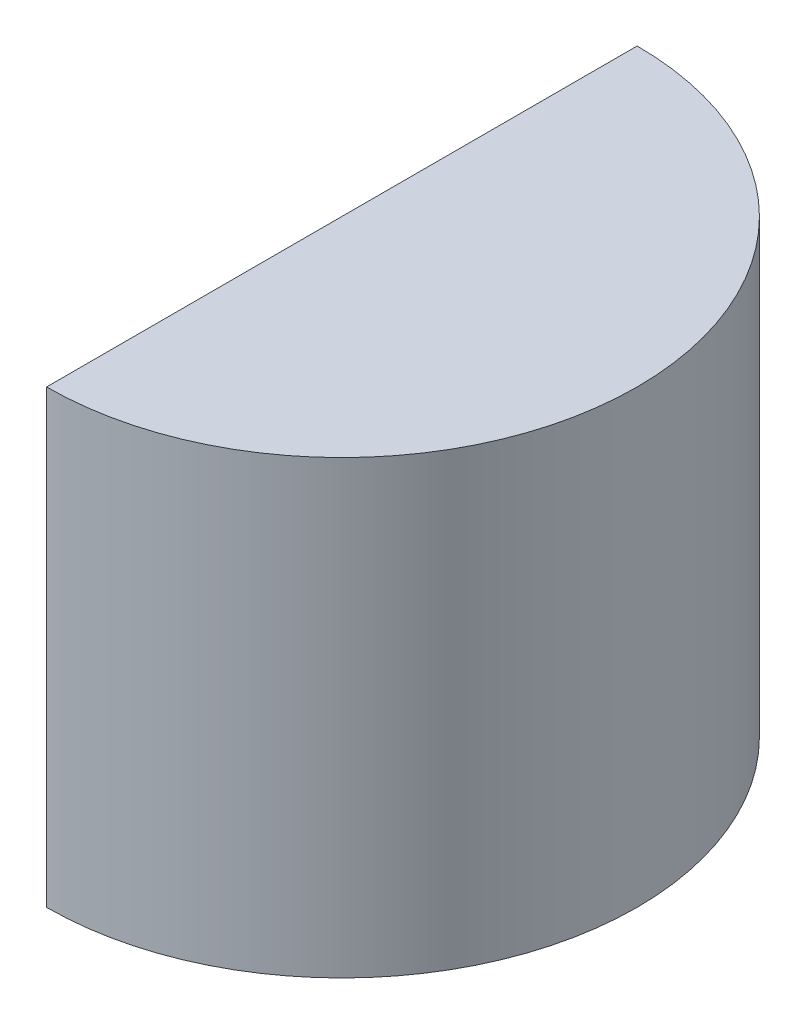
ISO-10303-21;
HEADER;
FILE_DESCRIPTION(('STEP AP214'),'2;1');
FILE_NAME('part.step','',(''),(''),'','','');
FILE_SCHEMA(('AUTOMOTIVE_DESIGN { 1 0 10303 214 1 1 1 1 }'));
ENDSEC;
DATA;
#1=APPLICATION_CONTEXT('core data for automotive mechanical design processes');
#2=APPLICATION_PROTOCOL_DEFINITION('international standard','automotive_design',2000,#1);
#3=PRODUCT_CONTEXT('',#1,'mechanical');
#4=PRODUCT('Part','Part','',(#3));
#5=PRODUCT_RELATED_PRODUCT_CATEGORY('part','',(#4));
#6=PRODUCT_DEFINITION_FORMATION('','',#4);
#7=PRODUCT_DEFINITION_CONTEXT('part definition',#1,'design');
#8=PRODUCT_DEFINITION('design','',#6,#7);
#9=PRODUCT_DEFINITION_SHAPE('','',#8);
#10=(LENGTH_UNIT() NAMED_UNIT(*) SI_UNIT(.MILLI.,.METRE.));
#11=(NAMED_UNIT(*) PLANE_ANGLE_UNIT() SI_UNIT($,.RADIAN.));
#12=(NAMED_UNIT(*) SI_UNIT($,.STERADIAN.) SOLID_ANGLE_UNIT());
#13=UNCERTAINTY_MEASURE_WITH_UNIT(LENGTH_MEASURE(1.E-05),#10,'distance_accuracy_value','');
#14=(GEOMETRIC_REPRESENTATION_CONTEXT(3) GLOBAL_UNCERTAINTY_ASSIGNED_CONTEXT((#13)) GLOBAL_UNIT_ASSIGNED_CONTEXT((#10,
#11,#12)) REPRESENTATION_CONTEXT('',''));
#15=CARTESIAN_POINT('',(0.,0.,0.));
#16=DIRECTION('',(0.,0.,1.));
#17=DIRECTION('',(1.,0.,0.));
#18=AXIS2_PLACEMENT_3D('',#15,#16,#17);
#19=CARTESIAN_POINT('',(0.,30.0650544116778,-19.01));
#20=DIRECTION('',(-1.,0.,0.));
#21=DIRECTION('',(0.,0.,1.));
#22=AXIS2_PLACEMENT_3D('',#19,#20,#21);
#23=PLANE('',#22);
#24=DIRECTION('',(0.,0.,1.));
#25=VECTOR('',#24,1.);
#26=CARTESIAN_POINT('',(0.,29.,0.));
#27=LINE('',#26,#25);
#28=CARTESIAN_POINT('',(0.,29.,-19.));
#29=VERTEX_POINT('',#28);
#30=CARTESIAN_POINT('',(0.,29.,19.));
#31=VERTEX_POINT('',#30);
#32=EDGE_CURVE('E54',#29,#31,#27,.T.);
#33=ORIENTED_EDGE('',*,*,#32,.F.);
#34=DIRECTION('',(0.,-1.,0.));
#35=VECTOR('',#34,1.);
#36=CARTESIAN_POINT('',(0.,29.,-19.));
#37=LINE('',#36,#35);
#38=CARTESIAN_POINT('',(0.,0.,-19.));
#39=VERTEX_POINT('',#38);
#40=EDGE_CURVE('E75',#29,#39,#37,.T.);
#41=ORIENTED_EDGE('',*,*,#40,.T.);
#42=DIRECTION('',(0.,0.,1.));
#43=VECTOR('',#42,1.);
#44=CARTESIAN_POINT('',(0.,0.,0.));
#45=LINE('',#44,#43);
#46=CARTESIAN_POINT('',(0.,0.,19.));
#47=VERTEX_POINT('',#46);
#48=EDGE_CURVE('E69',#39,#47,#45,.T.);
#49=ORIENTED_EDGE('',*,*,#48,.T.);
#50=DIRECTION('',(0.,-1.,0.));
#51=VECTOR('',#50,1.);
#52=CARTESIAN_POINT('',(0.,29.,19.));
#53=LINE('',#52,#51);
#54=EDGE_CURVE('E72',#47,#31,#53,.F.);
#55=ORIENTED_EDGE('',*,*,#54,.T.);
#56=EDGE_LOOP('',(#33,#41,#49,#55));
#57=FACE_BOUND('',#56,.T.);
#58=ADVANCED_FACE('F39',(#57),#23,.T.);
#59=CARTESIAN_POINT('',(0.,29.,0.));
#60=DIRECTION('',(0.,-1.,0.));
#61=DIRECTION('',(0.,0.,-1.));
#62=AXIS2_PLACEMENT_3D('',#59,#60,#61);
#63=CYLINDRICAL_SURFACE('',#62,19.);
#64=ORIENTED_EDGE('',*,*,#40,.F.);
#65=CARTESIAN_POINT('',(0.,29.,0.));
#66=DIRECTION('',(0.,1.,0.));
#67=DIRECTION('',(0.,0.,1.));
#68=AXIS2_PLACEMENT_3D('',#65,#66,#67);
#69=CIRCLE('',#68,19.);
#70=EDGE_CURVE('E48',#31,#29,#69,.T.);
#71=ORIENTED_EDGE('',*,*,#70,.F.);
#72=ORIENTED_EDGE('',*,*,#54,.F.);
#73=CARTESIAN_POINT('',(0.,0.,0.));
#74=DIRECTION('',(0.,1.,0.));
#75=DIRECTION('',(0.,0.,1.));
#76=AXIS2_PLACEMENT_3D('',#73,#74,#75);
#77=CIRCLE('',#76,19.);
#78=EDGE_CURVE('E11',#47,#39,#77,.T.);
#79=ORIENTED_EDGE('',*,*,#78,.T.);
#80=EDGE_LOOP('',(#64,#71,#72,#79));
#81=FACE_BOUND('',#80,.T.);
#82=ADVANCED_FACE('F73',(#81),#63,.T.);
#83=CARTESIAN_POINT('',(0.,29.,0.));
#84=DIRECTION('',(0.,1.,0.));
#85=DIRECTION('',(0.,0.,1.));
#86=AXIS2_PLACEMENT_3D('',#83,#84,#85);
#87=PLANE('',#86);
#88=ORIENTED_EDGE('',*,*,#70,.T.);
#89=ORIENTED_EDGE('',*,*,#32,.T.);
#90=EDGE_LOOP('',(#88,#89));
#91=FACE_BOUND('',#90,.T.);
#92=ADVANCED_FACE('F41',(#91),#87,.T.);
#93=CARTESIAN_POINT('',(0.,0.,0.));
#94=DIRECTION('',(0.,1.,0.));
#95=DIRECTION('',(0.,0.,1.));
#96=AXIS2_PLACEMENT_3D('',#93,#94,#95);
#97=PLANE('',#96);
#98=ORIENTED_EDGE('',*,*,#48,.F.);
#99=ORIENTED_EDGE('',*,*,#78,.F.);
#100=EDGE_LOOP('',(#98,#99));
#101=FACE_BOUND('',#100,.T.);
#102=ADVANCED_FACE('F67',(#101),#97,.F.);
#103=CLOSED_SHELL('',(#58,#82,#92,#102));
#104=MANIFOLD_SOLID_BREP('B2',#103);
#105=ADVANCED_BREP_SHAPE_REPRESENTATION('',(#18,#104),#14);
#106=SHAPE_DEFINITION_REPRESENTATION(#9,#105);
ENDSEC;
END-ISO-10303-21;
